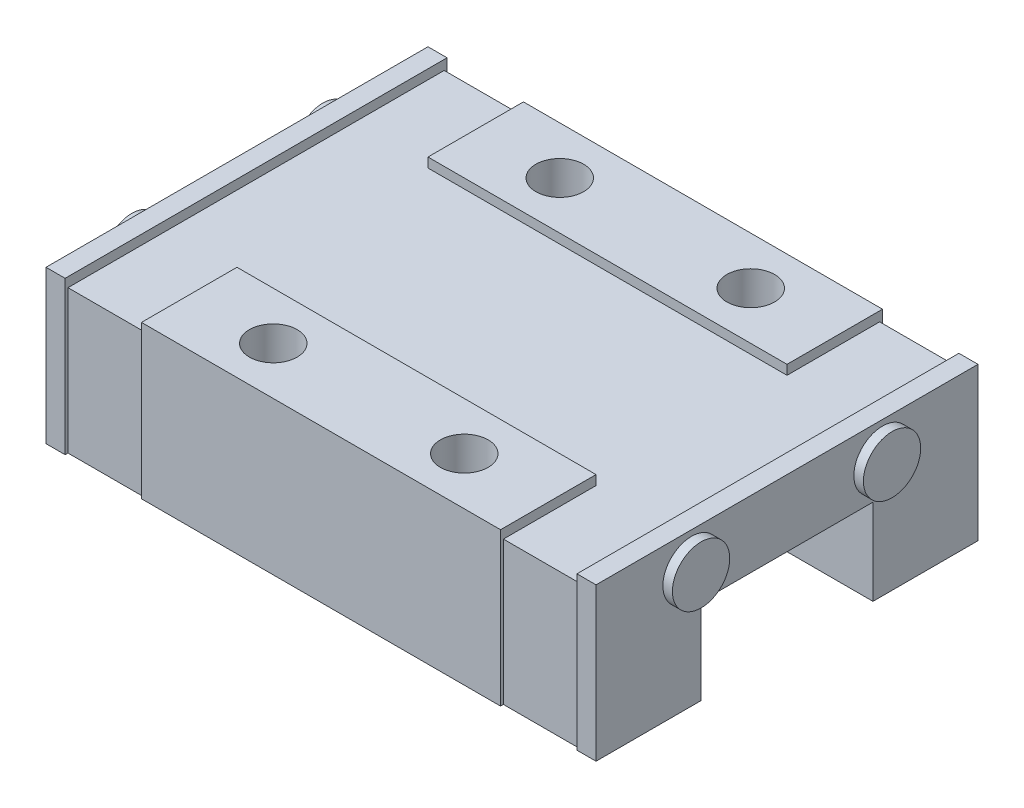
ISO-10303-21;
HEADER;
FILE_DESCRIPTION(('STEP AP214'),'2;1');
FILE_NAME('part.step','',(''),(''),'','','');
FILE_SCHEMA(('AUTOMOTIVE_DESIGN { 1 0 10303 214 1 1 1 1 }'));
ENDSEC;
DATA;
#1=APPLICATION_CONTEXT('core data for automotive mechanical design processes');
#2=APPLICATION_PROTOCOL_DEFINITION('international standard','automotive_design',2000,#1);
#3=PRODUCT_CONTEXT('',#1,'mechanical');
#4=PRODUCT('Part','Part','',(#3));
#5=PRODUCT_RELATED_PRODUCT_CATEGORY('part','',(#4));
#6=PRODUCT_DEFINITION_FORMATION('','',#4);
#7=PRODUCT_DEFINITION_CONTEXT('part definition',#1,'design');
#8=PRODUCT_DEFINITION('design','',#6,#7);
#9=PRODUCT_DEFINITION_SHAPE('','',#8);
#10=(LENGTH_UNIT() NAMED_UNIT(*) SI_UNIT(.MILLI.,.METRE.));
#11=(NAMED_UNIT(*) PLANE_ANGLE_UNIT() SI_UNIT($,.RADIAN.));
#12=(NAMED_UNIT(*) SI_UNIT($,.STERADIAN.) SOLID_ANGLE_UNIT());
#13=UNCERTAINTY_MEASURE_WITH_UNIT(LENGTH_MEASURE(1.E-05),#10,'distance_accuracy_value','');
#14=(GEOMETRIC_REPRESENTATION_CONTEXT(3) GLOBAL_UNCERTAINTY_ASSIGNED_CONTEXT((#13)) GLOBAL_UNIT_ASSIGNED_CONTEXT((#10,
#11,#12)) REPRESENTATION_CONTEXT('',''));
#15=CARTESIAN_POINT('',(0.,0.,0.));
#16=DIRECTION('',(0.,0.,1.));
#17=DIRECTION('',(1.,0.,0.));
#18=AXIS2_PLACEMENT_3D('',#15,#16,#17);
#19=CARTESIAN_POINT('',(0.,8.,0.));
#20=DIRECTION('',(1.,0.,0.));
#21=DIRECTION('',(0.,0.,-1.));
#22=AXIS2_PLACEMENT_3D('',#19,#20,#21);
#23=PLANE('',#22);
#24=DIRECTION('',(0.,0.,1.));
#25=VECTOR('',#24,1.);
#26=CARTESIAN_POINT('',(0.,0.,0.));
#27=LINE('',#26,#25);
#28=CARTESIAN_POINT('',(0.,0.,-20.));
#29=VERTEX_POINT('',#28);
#30=CARTESIAN_POINT('',(0.,0.,-19.85));
#31=VERTEX_POINT('',#30);
#32=EDGE_CURVE('E487',#29,#31,#27,.T.);
#33=ORIENTED_EDGE('',*,*,#32,.T.);
#34=DIRECTION('',(0.,1.,0.));
#35=VECTOR('',#34,1.);
#36=CARTESIAN_POINT('',(0.,0.,-19.85));
#37=LINE('',#36,#35);
#38=CARTESIAN_POINT('',(0.,7.5,-19.85));
#39=VERTEX_POINT('',#38);
#40=EDGE_CURVE('E329',#31,#39,#37,.T.);
#41=ORIENTED_EDGE('',*,*,#40,.T.);
#42=DIRECTION('',(0.,0.,1.));
#43=VECTOR('',#42,1.);
#44=CARTESIAN_POINT('',(0.,7.5,-14.5));
#45=LINE('',#44,#43);
#46=CARTESIAN_POINT('',(0.,7.5,-15.));
#47=VERTEX_POINT('',#46);
#48=EDGE_CURVE('E333',#39,#47,#45,.T.);
#49=ORIENTED_EDGE('',*,*,#48,.T.);
#50=DIRECTION('',(0.,1.,0.));
#51=VECTOR('',#50,1.);
#52=CARTESIAN_POINT('',(0.,7.5,-15.));
#53=LINE('',#52,#51);
#54=CARTESIAN_POINT('',(0.,8.,-15.));
#55=VERTEX_POINT('',#54);
#56=EDGE_CURVE('E424',#47,#55,#53,.T.);
#57=ORIENTED_EDGE('',*,*,#56,.T.);
#58=DIRECTION('',(0.,0.,1.));
#59=VECTOR('',#58,1.);
#60=CARTESIAN_POINT('',(0.,8.,0.));
#61=LINE('',#60,#59);
#62=CARTESIAN_POINT('',(0.,8.,-20.));
#63=VERTEX_POINT('',#62);
#64=EDGE_CURVE('E470',#63,#55,#61,.T.);
#65=ORIENTED_EDGE('',*,*,#64,.F.);
#66=DIRECTION('',(0.,-1.,0.));
#67=VECTOR('',#66,1.);
#68=CARTESIAN_POINT('',(0.,8.,-20.));
#69=LINE('',#68,#67);
#70=EDGE_CURVE('E486',#63,#29,#69,.T.);
#71=ORIENTED_EDGE('',*,*,#70,.T.);
#72=EDGE_LOOP('',(#33,#41,#49,#57,#65,#71));
#73=FACE_BOUND('',#72,.T.);
#74=ADVANCED_FACE('F43',(#73),#23,.F.);
#75=CARTESIAN_POINT('',(18.8,8.,0.));
#76=DIRECTION('',(-1.,0.,0.));
#77=DIRECTION('',(0.,0.,1.));
#78=AXIS2_PLACEMENT_3D('',#75,#76,#77);
#79=PLANE('',#78);
#80=DIRECTION('',(0.,-1.,0.));
#81=VECTOR('',#80,1.);
#82=CARTESIAN_POINT('',(18.8,0.,-0.15));
#83=LINE('',#82,#81);
#84=CARTESIAN_POINT('',(18.8,7.5,-0.15));
#85=VERTEX_POINT('',#84);
#86=CARTESIAN_POINT('',(18.8,0.,-0.15));
#87=VERTEX_POINT('',#86);
#88=EDGE_CURVE('E67',#85,#87,#83,.T.);
#89=ORIENTED_EDGE('',*,*,#88,.F.);
#90=DIRECTION('',(0.,0.,1.));
#91=VECTOR('',#90,1.);
#92=CARTESIAN_POINT('',(18.8,7.5,-5.5));
#93=LINE('',#92,#91);
#94=CARTESIAN_POINT('',(18.8,7.5,-5.));
#95=VERTEX_POINT('',#94);
#96=EDGE_CURVE('E385',#95,#85,#93,.T.);
#97=ORIENTED_EDGE('',*,*,#96,.F.);
#98=DIRECTION('',(0.,1.,0.));
#99=VECTOR('',#98,1.);
#100=CARTESIAN_POINT('',(18.8,7.5,-5.));
#101=LINE('',#100,#99);
#102=CARTESIAN_POINT('',(18.8,8.,-5.));
#103=VERTEX_POINT('',#102);
#104=EDGE_CURVE('E432',#95,#103,#101,.T.);
#105=ORIENTED_EDGE('',*,*,#104,.T.);
#106=DIRECTION('',(0.,0.,-1.));
#107=VECTOR('',#106,1.);
#108=CARTESIAN_POINT('',(18.8,8.,0.));
#109=LINE('',#108,#107);
#110=CARTESIAN_POINT('',(18.8,8.,0.));
#111=VERTEX_POINT('',#110);
#112=EDGE_CURVE('E479',#111,#103,#109,.T.);
#113=ORIENTED_EDGE('',*,*,#112,.F.);
#114=DIRECTION('',(0.,-1.,0.));
#115=VECTOR('',#114,1.);
#116=CARTESIAN_POINT('',(18.8,8.,0.));
#117=LINE('',#116,#115);
#118=CARTESIAN_POINT('',(18.8,0.,0.));
#119=VERTEX_POINT('',#118);
#120=EDGE_CURVE('E508',#111,#119,#117,.T.);
#121=ORIENTED_EDGE('',*,*,#120,.T.);
#122=DIRECTION('',(0.,0.,-1.));
#123=VECTOR('',#122,1.);
#124=CARTESIAN_POINT('',(18.8,0.,0.));
#125=LINE('',#124,#123);
#126=EDGE_CURVE('E495',#119,#87,#125,.T.);
#127=ORIENTED_EDGE('',*,*,#126,.T.);
#128=EDGE_LOOP('',(#89,#97,#105,#113,#121,#127));
#129=FACE_BOUND('',#128,.T.);
#130=ADVANCED_FACE('F678',(#129),#79,.F.);
#131=CARTESIAN_POINT('',(18.8,7.5,-19.85));
#132=VERTEX_POINT('',#131);
#133=CARTESIAN_POINT('',(18.8,7.5,-15.));
#134=VERTEX_POINT('',#133);
#135=EDGE_CURVE('E381',#132,#134,#93,.T.);
#136=ORIENTED_EDGE('',*,*,#135,.F.);
#137=DIRECTION('',(0.,1.,0.));
#138=VECTOR('',#137,1.);
#139=CARTESIAN_POINT('',(18.8,0.,-19.85));
#140=LINE('',#139,#138);
#141=CARTESIAN_POINT('',(18.8,0.,-19.85));
#142=VERTEX_POINT('',#141);
#143=EDGE_CURVE('E364',#142,#132,#140,.T.);
#144=ORIENTED_EDGE('',*,*,#143,.F.);
#145=CARTESIAN_POINT('',(18.8,0.,-20.));
#146=VERTEX_POINT('',#145);
#147=EDGE_CURVE('E494',#142,#146,#125,.T.);
#148=ORIENTED_EDGE('',*,*,#147,.T.);
#149=DIRECTION('',(0.,-1.,0.));
#150=VECTOR('',#149,1.);
#151=CARTESIAN_POINT('',(18.8,8.,-20.));
#152=LINE('',#151,#150);
#153=CARTESIAN_POINT('',(18.8,8.,-20.));
#154=VERTEX_POINT('',#153);
#155=EDGE_CURVE('E504',#154,#146,#152,.T.);
#156=ORIENTED_EDGE('',*,*,#155,.F.);
#157=CARTESIAN_POINT('',(18.8,8.,-15.));
#158=VERTEX_POINT('',#157);
#159=EDGE_CURVE('E478',#158,#154,#109,.T.);
#160=ORIENTED_EDGE('',*,*,#159,.F.);
#161=DIRECTION('',(0.,1.,0.));
#162=VECTOR('',#161,1.);
#163=CARTESIAN_POINT('',(18.8,7.5,-15.));
#164=LINE('',#163,#162);
#165=EDGE_CURVE('E429',#134,#158,#164,.T.);
#166=ORIENTED_EDGE('',*,*,#165,.F.);
#167=EDGE_LOOP('',(#136,#144,#148,#156,#160,#166));
#168=FACE_BOUND('',#167,.T.);
#169=ADVANCED_FACE('F546',(#168),#79,.F.);
#170=CARTESIAN_POINT('',(0.,0.,0.));
#171=DIRECTION('',(0.,-1.,0.));
#172=DIRECTION('',(0.,0.,-1.));
#173=AXIS2_PLACEMENT_3D('',#170,#171,#172);
#174=PLANE('',#173);
#175=ORIENTED_EDGE('',*,*,#147,.F.);
#176=DIRECTION('',(-1.,0.,0.));
#177=VECTOR('',#176,1.);
#178=CARTESIAN_POINT('',(22.8,0.,-19.85));
#179=LINE('',#178,#177);
#180=CARTESIAN_POINT('',(22.8,0.,-19.85));
#181=VERTEX_POINT('',#180);
#182=EDGE_CURVE('E399',#181,#142,#179,.T.);
#183=ORIENTED_EDGE('',*,*,#182,.F.);
#184=DIRECTION('',(0.,0.,-1.));
#185=VECTOR('',#184,1.);
#186=CARTESIAN_POINT('',(22.8,0.,-20.));
#187=LINE('',#186,#185);
#188=CARTESIAN_POINT('',(22.8,0.,-20.));
#189=VERTEX_POINT('',#188);
#190=EDGE_CURVE('E304',#181,#189,#187,.T.);
#191=ORIENTED_EDGE('',*,*,#190,.T.);
#192=DIRECTION('',(-1.,0.,0.));
#193=VECTOR('',#192,1.);
#194=CARTESIAN_POINT('',(23.8,0.,-20.));
#195=LINE('',#194,#193);
#196=CARTESIAN_POINT('',(23.8,0.,-20.));
#197=VERTEX_POINT('',#196);
#198=EDGE_CURVE('E320',#197,#189,#195,.T.);
#199=ORIENTED_EDGE('',*,*,#198,.F.);
#200=DIRECTION('',(0.,0.,-1.));
#201=VECTOR('',#200,1.);
#202=CARTESIAN_POINT('',(23.8,0.,-14.5));
#203=LINE('',#202,#201);
#204=CARTESIAN_POINT('',(23.8,0.,-14.5));
#205=VERTEX_POINT('',#204);
#206=EDGE_CURVE('E291',#205,#197,#203,.T.);
#207=ORIENTED_EDGE('',*,*,#206,.F.);
#208=DIRECTION('',(-1.,0.,0.));
#209=VECTOR('',#208,1.);
#210=CARTESIAN_POINT('',(0.,0.,-14.5));
#211=LINE('',#210,#209);
#212=CARTESIAN_POINT('',(-5.,0.,-14.5));
#213=VERTEX_POINT('',#212);
#214=EDGE_CURVE('E516',#205,#213,#211,.T.);
#215=ORIENTED_EDGE('',*,*,#214,.T.);
#216=DIRECTION('',(0.,0.,-1.));
#217=VECTOR('',#216,1.);
#218=CARTESIAN_POINT('',(-5.,0.,-20.));
#219=LINE('',#218,#217);
#220=CARTESIAN_POINT('',(-5.,0.,-20.));
#221=VERTEX_POINT('',#220);
#222=EDGE_CURVE('E616',#213,#221,#219,.T.);
#223=ORIENTED_EDGE('',*,*,#222,.T.);
#224=DIRECTION('',(-1.,0.,0.));
#225=VECTOR('',#224,1.);
#226=CARTESIAN_POINT('',(-4.,0.,-20.));
#227=LINE('',#226,#225);
#228=CARTESIAN_POINT('',(-4.,0.,-20.));
#229=VERTEX_POINT('',#228);
#230=EDGE_CURVE('E258',#229,#221,#227,.T.);
#231=ORIENTED_EDGE('',*,*,#230,.F.);
#232=DIRECTION('',(0.,0.,-1.));
#233=VECTOR('',#232,1.);
#234=CARTESIAN_POINT('',(-4.,0.,-14.5));
#235=LINE('',#234,#233);
#236=CARTESIAN_POINT('',(-4.,0.,-19.85));
#237=VERTEX_POINT('',#236);
#238=EDGE_CURVE('E240',#237,#229,#235,.T.);
#239=ORIENTED_EDGE('',*,*,#238,.F.);
#240=DIRECTION('',(-1.,0.,0.));
#241=VECTOR('',#240,1.);
#242=CARTESIAN_POINT('',(0.,0.,-19.85));
#243=LINE('',#242,#241);
#244=EDGE_CURVE('E360',#31,#237,#243,.T.);
#245=ORIENTED_EDGE('',*,*,#244,.F.);
#246=ORIENTED_EDGE('',*,*,#32,.F.);
#247=DIRECTION('',(-1.,0.,0.));
#248=VECTOR('',#247,1.);
#249=CARTESIAN_POINT('',(0.,0.,-20.));
#250=LINE('',#249,#248);
#251=EDGE_CURVE('E498',#146,#29,#250,.T.);
#252=ORIENTED_EDGE('',*,*,#251,.F.);
#253=EDGE_LOOP('',(#175,#183,#191,#199,#207,#215,#223,#231,#239,#245,#246,#252));
#254=FACE_BOUND('',#253,.T.);
#255=ADVANCED_FACE('F551',(#254),#174,.T.);
#256=CARTESIAN_POINT('',(0.,8.,0.));
#257=DIRECTION('',(0.,-1.,0.));
#258=DIRECTION('',(0.,0.,-1.));
#259=AXIS2_PLACEMENT_3D('',#256,#257,#258);
#260=PLANE('',#259);
#261=CARTESIAN_POINT('',(14.4,8.,-17.5));
#262=DIRECTION('',(0.,1.,0.));
#263=DIRECTION('',(0.,0.,1.));
#264=AXIS2_PLACEMENT_3D('',#261,#262,#263);
#265=CIRCLE('',#264,1.25);
#266=CARTESIAN_POINT('',(14.4,8.,-16.25));
#267=VERTEX_POINT('',#266);
#268=EDGE_CURVE('E447',#267,#267,#265,.T.);
#269=ORIENTED_EDGE('',*,*,#268,.F.);
#270=EDGE_LOOP('',(#269));
#271=FACE_BOUND('',#270,.T.);
#272=CARTESIAN_POINT('',(4.39999999999995,8.,-17.5));
#273=DIRECTION('',(0.,1.,0.));
#274=DIRECTION('',(0.,0.,1.));
#275=AXIS2_PLACEMENT_3D('',#272,#273,#274);
#276=CIRCLE('',#275,1.25);
#277=CARTESIAN_POINT('',(4.39999999999995,8.,-16.25));
#278=VERTEX_POINT('',#277);
#279=EDGE_CURVE('E455',#278,#278,#276,.T.);
#280=ORIENTED_EDGE('',*,*,#279,.F.);
#281=EDGE_LOOP('',(#280));
#282=FACE_BOUND('',#281,.T.);
#283=ORIENTED_EDGE('',*,*,#64,.T.);
#284=DIRECTION('',(-1.,0.,0.));
#285=VECTOR('',#284,1.);
#286=CARTESIAN_POINT('',(0.,8.,-15.));
#287=LINE('',#286,#285);
#288=EDGE_CURVE('E415',#158,#55,#287,.T.);
#289=ORIENTED_EDGE('',*,*,#288,.F.);
#290=ORIENTED_EDGE('',*,*,#159,.T.);
#291=DIRECTION('',(-1.,0.,0.));
#292=VECTOR('',#291,1.);
#293=CARTESIAN_POINT('',(0.,8.,-20.));
#294=LINE('',#293,#292);
#295=EDGE_CURVE('E483',#154,#63,#294,.T.);
#296=ORIENTED_EDGE('',*,*,#295,.T.);
#297=EDGE_LOOP('',(#283,#289,#290,#296));
#298=FACE_BOUND('',#297,.T.);
#299=ADVANCED_FACE('F572',(#271,#282,#298),#260,.F.);
#300=DIRECTION('',(0.,1.,0.));
#301=VECTOR('',#300,1.);
#302=CARTESIAN_POINT('',(0.,7.5,-5.));
#303=LINE('',#302,#301);
#304=CARTESIAN_POINT('',(0.,7.5,-5.));
#305=VERTEX_POINT('',#304);
#306=CARTESIAN_POINT('',(0.,8.,-5.));
#307=VERTEX_POINT('',#306);
#308=EDGE_CURVE('E419',#305,#307,#303,.T.);
#309=ORIENTED_EDGE('',*,*,#308,.F.);
#310=CARTESIAN_POINT('',(0.,7.5,-0.15));
#311=VERTEX_POINT('',#310);
#312=EDGE_CURVE('E338',#305,#311,#45,.T.);
#313=ORIENTED_EDGE('',*,*,#312,.T.);
#314=DIRECTION('',(0.,-1.,0.));
#315=VECTOR('',#314,1.);
#316=CARTESIAN_POINT('',(0.,0.,-0.15));
#317=LINE('',#316,#315);
#318=CARTESIAN_POINT('',(0.,0.,-0.15));
#319=VERTEX_POINT('',#318);
#320=EDGE_CURVE('E337',#311,#319,#317,.T.);
#321=ORIENTED_EDGE('',*,*,#320,.T.);
#322=CARTESIAN_POINT('',(0.,0.,0.));
#323=VERTEX_POINT('',#322);
#324=EDGE_CURVE('E466',#319,#323,#27,.T.);
#325=ORIENTED_EDGE('',*,*,#324,.T.);
#326=DIRECTION('',(0.,-1.,0.));
#327=VECTOR('',#326,1.);
#328=CARTESIAN_POINT('',(0.,8.,0.));
#329=LINE('',#328,#327);
#330=CARTESIAN_POINT('',(0.,8.,0.));
#331=VERTEX_POINT('',#330);
#332=EDGE_CURVE('E512',#331,#323,#329,.T.);
#333=ORIENTED_EDGE('',*,*,#332,.F.);
#334=EDGE_CURVE('E475',#307,#331,#61,.T.);
#335=ORIENTED_EDGE('',*,*,#334,.F.);
#336=EDGE_LOOP('',(#309,#313,#321,#325,#333,#335));
#337=FACE_BOUND('',#336,.T.);
#338=ADVANCED_FACE('F45',(#337),#23,.F.);
#339=CARTESIAN_POINT('',(0.,8.,0.));
#340=DIRECTION('',(0.,0.,-1.));
#341=DIRECTION('',(-1.,0.,0.));
#342=AXIS2_PLACEMENT_3D('',#339,#340,#341);
#343=PLANE('',#342);
#344=DIRECTION('',(1.,0.,0.));
#345=VECTOR('',#344,1.);
#346=CARTESIAN_POINT('',(0.,0.,0.));
#347=LINE('',#346,#345);
#348=EDGE_CURVE('E491',#323,#119,#347,.T.);
#349=ORIENTED_EDGE('',*,*,#348,.T.);
#350=ORIENTED_EDGE('',*,*,#120,.F.);
#351=DIRECTION('',(1.,0.,0.));
#352=VECTOR('',#351,1.);
#353=CARTESIAN_POINT('',(0.,8.,0.));
#354=LINE('',#353,#352);
#355=EDGE_CURVE('E474',#331,#111,#354,.T.);
#356=ORIENTED_EDGE('',*,*,#355,.F.);
#357=ORIENTED_EDGE('',*,*,#332,.T.);
#358=EDGE_LOOP('',(#349,#350,#356,#357));
#359=FACE_BOUND('',#358,.T.);
#360=ADVANCED_FACE('F562',(#359),#343,.F.);
#361=CARTESIAN_POINT('',(0.,8.,-20.));
#362=DIRECTION('',(0.,0.,1.));
#363=DIRECTION('',(1.,0.,0.));
#364=AXIS2_PLACEMENT_3D('',#361,#362,#363);
#365=PLANE('',#364);
#366=ORIENTED_EDGE('',*,*,#251,.T.);
#367=ORIENTED_EDGE('',*,*,#70,.F.);
#368=ORIENTED_EDGE('',*,*,#295,.F.);
#369=ORIENTED_EDGE('',*,*,#155,.T.);
#370=EDGE_LOOP('',(#366,#367,#368,#369));
#371=FACE_BOUND('',#370,.T.);
#372=ADVANCED_FACE('F576',(#371),#365,.F.);
#373=CARTESIAN_POINT('',(14.4000000000001,8.,-2.5));
#374=DIRECTION('',(0.,1.,0.));
#375=DIRECTION('',(0.,0.,1.));
#376=AXIS2_PLACEMENT_3D('',#373,#374,#375);
#377=CIRCLE('',#376,1.25);
#378=CARTESIAN_POINT('',(14.4000000000001,8.,-1.25));
#379=VERTEX_POINT('',#378);
#380=EDGE_CURVE('E438',#379,#379,#377,.T.);
#381=ORIENTED_EDGE('',*,*,#380,.F.);
#382=EDGE_LOOP('',(#381));
#383=FACE_BOUND('',#382,.T.);
#384=CARTESIAN_POINT('',(4.4,8.,-2.5));
#385=DIRECTION('',(0.,1.,0.));
#386=DIRECTION('',(0.,0.,1.));
#387=AXIS2_PLACEMENT_3D('',#384,#385,#386);
#388=CIRCLE('',#387,1.25);
#389=CARTESIAN_POINT('',(4.4,8.,-1.25));
#390=VERTEX_POINT('',#389);
#391=EDGE_CURVE('E442',#390,#390,#388,.T.);
#392=ORIENTED_EDGE('',*,*,#391,.F.);
#393=EDGE_LOOP('',(#392));
#394=FACE_BOUND('',#393,.T.);
#395=ORIENTED_EDGE('',*,*,#112,.T.);
#396=DIRECTION('',(1.,0.,0.));
#397=VECTOR('',#396,1.);
#398=CARTESIAN_POINT('',(0.,8.,-5.));
#399=LINE('',#398,#397);
#400=EDGE_CURVE('E407',#307,#103,#399,.T.);
#401=ORIENTED_EDGE('',*,*,#400,.F.);
#402=ORIENTED_EDGE('',*,*,#334,.T.);
#403=ORIENTED_EDGE('',*,*,#355,.T.);
#404=EDGE_LOOP('',(#395,#401,#402,#403));
#405=FACE_BOUND('',#404,.T.);
#406=ADVANCED_FACE('F565',(#383,#394,#405),#260,.F.);
#407=DIRECTION('',(-1.,0.,0.));
#408=VECTOR('',#407,1.);
#409=CARTESIAN_POINT('',(0.,0.,-5.5));
#410=LINE('',#409,#408);
#411=CARTESIAN_POINT('',(23.8,0.,-5.5));
#412=VERTEX_POINT('',#411);
#413=CARTESIAN_POINT('',(-5.,0.,-5.5));
#414=VERTEX_POINT('',#413);
#415=EDGE_CURVE('E519',#412,#414,#410,.T.);
#416=ORIENTED_EDGE('',*,*,#415,.F.);
#417=DIRECTION('',(0.,0.,-1.));
#418=VECTOR('',#417,1.);
#419=CARTESIAN_POINT('',(23.8,0.,0.));
#420=LINE('',#419,#418);
#421=CARTESIAN_POINT('',(23.8,0.,0.));
#422=VERTEX_POINT('',#421);
#423=EDGE_CURVE('E274',#422,#412,#420,.T.);
#424=ORIENTED_EDGE('',*,*,#423,.F.);
#425=DIRECTION('',(-1.,0.,0.));
#426=VECTOR('',#425,1.);
#427=CARTESIAN_POINT('',(23.8,0.,0.));
#428=LINE('',#427,#426);
#429=CARTESIAN_POINT('',(22.8,0.,0.));
#430=VERTEX_POINT('',#429);
#431=EDGE_CURVE('E324',#422,#430,#428,.T.);
#432=ORIENTED_EDGE('',*,*,#431,.T.);
#433=DIRECTION('',(0.,0.,-1.));
#434=VECTOR('',#433,1.);
#435=CARTESIAN_POINT('',(22.8,0.,-5.5));
#436=LINE('',#435,#434);
#437=CARTESIAN_POINT('',(22.8,0.,-0.15));
#438=VERTEX_POINT('',#437);
#439=EDGE_CURVE('E263',#430,#438,#436,.T.);
#440=ORIENTED_EDGE('',*,*,#439,.T.);
#441=DIRECTION('',(-1.,0.,0.));
#442=VECTOR('',#441,1.);
#443=CARTESIAN_POINT('',(22.8,0.,-0.15));
#444=LINE('',#443,#442);
#445=EDGE_CURVE('E377',#438,#87,#444,.T.);
#446=ORIENTED_EDGE('',*,*,#445,.T.);
#447=ORIENTED_EDGE('',*,*,#126,.F.);
#448=ORIENTED_EDGE('',*,*,#348,.F.);
#449=ORIENTED_EDGE('',*,*,#324,.F.);
#450=DIRECTION('',(-1.,0.,0.));
#451=VECTOR('',#450,1.);
#452=CARTESIAN_POINT('',(0.,0.,-0.15));
#453=LINE('',#452,#451);
#454=CARTESIAN_POINT('',(-4.,0.,-0.15));
#455=VERTEX_POINT('',#454);
#456=EDGE_CURVE('E59',#319,#455,#453,.T.);
#457=ORIENTED_EDGE('',*,*,#456,.T.);
#458=DIRECTION('',(0.,0.,-1.));
#459=VECTOR('',#458,1.);
#460=CARTESIAN_POINT('',(-4.,0.,0.));
#461=LINE('',#460,#459);
#462=CARTESIAN_POINT('',(-4.,0.,0.));
#463=VERTEX_POINT('',#462);
#464=EDGE_CURVE('E230',#463,#455,#461,.T.);
#465=ORIENTED_EDGE('',*,*,#464,.F.);
#466=DIRECTION('',(-1.,0.,0.));
#467=VECTOR('',#466,1.);
#468=CARTESIAN_POINT('',(-4.,0.,0.));
#469=LINE('',#468,#467);
#470=CARTESIAN_POINT('',(-5.,0.,0.));
#471=VERTEX_POINT('',#470);
#472=EDGE_CURVE('E235',#463,#471,#469,.T.);
#473=ORIENTED_EDGE('',*,*,#472,.T.);
#474=DIRECTION('',(0.,0.,-1.));
#475=VECTOR('',#474,1.);
#476=CARTESIAN_POINT('',(-5.,0.,-5.5));
#477=LINE('',#476,#475);
#478=EDGE_CURVE('E600',#471,#414,#477,.T.);
#479=ORIENTED_EDGE('',*,*,#478,.T.);
#480=EDGE_LOOP('',(#416,#424,#432,#440,#446,#447,#448,#449,#457,#465,#473,#479));
#481=FACE_BOUND('',#480,.T.);
#482=ADVANCED_FACE('F232',(#481),#174,.T.);
#483=CARTESIAN_POINT('',(4.4,1.,-2.5));
#484=DIRECTION('',(0.,1.,0.));
#485=DIRECTION('',(0.,0.,1.));
#486=AXIS2_PLACEMENT_3D('',#483,#484,#485);
#487=CYLINDRICAL_SURFACE('',#486,1.25);
#488=CARTESIAN_POINT('',(4.4,1.,-2.5));
#489=DIRECTION('',(0.,1.,0.));
#490=DIRECTION('',(0.,0.,1.));
#491=AXIS2_PLACEMENT_3D('',#488,#489,#490);
#492=CIRCLE('',#491,1.25);
#493=CARTESIAN_POINT('',(4.4,1.,-1.25));
#494=VERTEX_POINT('',#493);
#495=EDGE_CURVE('E462',#494,#494,#492,.T.);
#496=ORIENTED_EDGE('',*,*,#495,.F.);
#497=EDGE_LOOP('',(#496));
#498=FACE_BOUND('',#497,.T.);
#499=ORIENTED_EDGE('',*,*,#391,.T.);
#500=EDGE_LOOP('',(#499));
#501=FACE_BOUND('',#500,.T.);
#502=ADVANCED_FACE('F705',(#498,#501),#487,.F.);
#503=CARTESIAN_POINT('',(4.4,1.,-2.5));
#504=DIRECTION('',(0.,1.,0.));
#505=DIRECTION('',(0.,0.,1.));
#506=AXIS2_PLACEMENT_3D('',#503,#504,#505);
#507=PLANE('',#506);
#508=ORIENTED_EDGE('',*,*,#495,.T.);
#509=EDGE_LOOP('',(#508));
#510=FACE_BOUND('',#509,.T.);
#511=ADVANCED_FACE('F713',(#510),#507,.T.);
#512=CARTESIAN_POINT('',(14.4000000000001,1.,-2.5));
#513=DIRECTION('',(0.,1.,0.));
#514=DIRECTION('',(0.,0.,1.));
#515=AXIS2_PLACEMENT_3D('',#512,#513,#514);
#516=CYLINDRICAL_SURFACE('',#515,1.25);
#517=CARTESIAN_POINT('',(14.4000000000001,1.,-2.5));
#518=DIRECTION('',(0.,1.,0.));
#519=DIRECTION('',(0.,0.,1.));
#520=AXIS2_PLACEMENT_3D('',#517,#518,#519);
#521=CIRCLE('',#520,1.25);
#522=CARTESIAN_POINT('',(14.4000000000001,1.,-1.25));
#523=VERTEX_POINT('',#522);
#524=EDGE_CURVE('E443',#523,#523,#521,.T.);
#525=ORIENTED_EDGE('',*,*,#524,.F.);
#526=EDGE_LOOP('',(#525));
#527=FACE_BOUND('',#526,.T.);
#528=ORIENTED_EDGE('',*,*,#380,.T.);
#529=EDGE_LOOP('',(#528));
#530=FACE_BOUND('',#529,.T.);
#531=ADVANCED_FACE('F718',(#527,#530),#516,.F.);
#532=CARTESIAN_POINT('',(14.4000000000001,1.,-2.5));
#533=DIRECTION('',(0.,1.,0.));
#534=DIRECTION('',(0.,0.,1.));
#535=AXIS2_PLACEMENT_3D('',#532,#533,#534);
#536=PLANE('',#535);
#537=ORIENTED_EDGE('',*,*,#524,.T.);
#538=EDGE_LOOP('',(#537));
#539=FACE_BOUND('',#538,.T.);
#540=ADVANCED_FACE('F737',(#539),#536,.T.);
#541=CARTESIAN_POINT('',(14.4,1.,-17.5));
#542=DIRECTION('',(0.,1.,0.));
#543=DIRECTION('',(0.,0.,1.));
#544=AXIS2_PLACEMENT_3D('',#541,#542,#543);
#545=CYLINDRICAL_SURFACE('',#544,1.25);
#546=CARTESIAN_POINT('',(14.4,1.,-17.5));
#547=DIRECTION('',(0.,1.,0.));
#548=DIRECTION('',(0.,0.,1.));
#549=AXIS2_PLACEMENT_3D('',#546,#547,#548);
#550=CIRCLE('',#549,1.25);
#551=CARTESIAN_POINT('',(14.4,1.,-16.25));
#552=VERTEX_POINT('',#551);
#553=EDGE_CURVE('E451',#552,#552,#550,.T.);
#554=ORIENTED_EDGE('',*,*,#553,.F.);
#555=EDGE_LOOP('',(#554));
#556=FACE_BOUND('',#555,.T.);
#557=ORIENTED_EDGE('',*,*,#268,.T.);
#558=EDGE_LOOP('',(#557));
#559=FACE_BOUND('',#558,.T.);
#560=ADVANCED_FACE('F733',(#556,#559),#545,.F.);
#561=CARTESIAN_POINT('',(14.4,1.,-17.5));
#562=DIRECTION('',(0.,1.,0.));
#563=DIRECTION('',(0.,0.,1.));
#564=AXIS2_PLACEMENT_3D('',#561,#562,#563);
#565=PLANE('',#564);
#566=ORIENTED_EDGE('',*,*,#553,.T.);
#567=EDGE_LOOP('',(#566));
#568=FACE_BOUND('',#567,.T.);
#569=ADVANCED_FACE('F729',(#568),#565,.T.);
#570=CARTESIAN_POINT('',(4.39999999999995,1.,-17.5));
#571=DIRECTION('',(0.,1.,0.));
#572=DIRECTION('',(0.,0.,1.));
#573=AXIS2_PLACEMENT_3D('',#570,#571,#572);
#574=CYLINDRICAL_SURFACE('',#573,1.25);
#575=CARTESIAN_POINT('',(4.39999999999995,1.,-17.5));
#576=DIRECTION('',(0.,1.,0.));
#577=DIRECTION('',(0.,0.,1.));
#578=AXIS2_PLACEMENT_3D('',#575,#576,#577);
#579=CIRCLE('',#578,1.25);
#580=CARTESIAN_POINT('',(4.39999999999995,1.,-16.25));
#581=VERTEX_POINT('',#580);
#582=EDGE_CURVE('E428',#581,#581,#579,.T.);
#583=ORIENTED_EDGE('',*,*,#582,.F.);
#584=EDGE_LOOP('',(#583));
#585=FACE_BOUND('',#584,.T.);
#586=ORIENTED_EDGE('',*,*,#279,.T.);
#587=EDGE_LOOP('',(#586));
#588=FACE_BOUND('',#587,.T.);
#589=ADVANCED_FACE('F725',(#585,#588),#574,.F.);
#590=CARTESIAN_POINT('',(4.39999999999995,1.,-17.5));
#591=DIRECTION('',(0.,1.,0.));
#592=DIRECTION('',(0.,0.,1.));
#593=AXIS2_PLACEMENT_3D('',#590,#591,#592);
#594=PLANE('',#593);
#595=ORIENTED_EDGE('',*,*,#582,.T.);
#596=EDGE_LOOP('',(#595));
#597=FACE_BOUND('',#596,.T.);
#598=ADVANCED_FACE('F723',(#597),#594,.T.);
#599=CARTESIAN_POINT('',(0.,7.5,-15.));
#600=DIRECTION('',(0.,0.,-1.));
#601=DIRECTION('',(-1.,0.,0.));
#602=AXIS2_PLACEMENT_3D('',#599,#600,#601);
#603=PLANE('',#602);
#604=ORIENTED_EDGE('',*,*,#288,.T.);
#605=ORIENTED_EDGE('',*,*,#56,.F.);
#606=DIRECTION('',(-1.,0.,0.));
#607=VECTOR('',#606,1.);
#608=CARTESIAN_POINT('',(0.,7.5,-15.));
#609=LINE('',#608,#607);
#610=EDGE_CURVE('E414',#134,#47,#609,.T.);
#611=ORIENTED_EDGE('',*,*,#610,.F.);
#612=ORIENTED_EDGE('',*,*,#165,.T.);
#613=EDGE_LOOP('',(#604,#605,#611,#612));
#614=FACE_BOUND('',#613,.T.);
#615=ADVANCED_FACE('F582',(#614),#603,.F.);
#616=CARTESIAN_POINT('',(0.,7.5,-5.));
#617=DIRECTION('',(0.,0.,1.));
#618=DIRECTION('',(1.,0.,0.));
#619=AXIS2_PLACEMENT_3D('',#616,#617,#618);
#620=PLANE('',#619);
#621=ORIENTED_EDGE('',*,*,#400,.T.);
#622=ORIENTED_EDGE('',*,*,#104,.F.);
#623=DIRECTION('',(1.,0.,0.));
#624=VECTOR('',#623,1.);
#625=CARTESIAN_POINT('',(0.,7.5,-5.));
#626=LINE('',#625,#624);
#627=EDGE_CURVE('E410',#305,#95,#626,.T.);
#628=ORIENTED_EDGE('',*,*,#627,.F.);
#629=ORIENTED_EDGE('',*,*,#308,.T.);
#630=EDGE_LOOP('',(#621,#622,#628,#629));
#631=FACE_BOUND('',#630,.T.);
#632=ADVANCED_FACE('F745',(#631),#620,.F.);
#633=CARTESIAN_POINT('',(0.,7.5,0.));
#634=DIRECTION('',(0.,1.,0.));
#635=DIRECTION('',(0.,0.,1.));
#636=AXIS2_PLACEMENT_3D('',#633,#634,#635);
#637=PLANE('',#636);
#638=ORIENTED_EDGE('',*,*,#610,.T.);
#639=ORIENTED_EDGE('',*,*,#48,.F.);
#640=DIRECTION('',(-1.,0.,0.));
#641=VECTOR('',#640,1.);
#642=CARTESIAN_POINT('',(0.,7.5,-19.85));
#643=LINE('',#642,#641);
#644=CARTESIAN_POINT('',(-4.,7.5,-19.85));
#645=VERTEX_POINT('',#644);
#646=EDGE_CURVE('E356',#39,#645,#643,.T.);
#647=ORIENTED_EDGE('',*,*,#646,.T.);
#648=DIRECTION('',(0.,0.,1.));
#649=VECTOR('',#648,1.);
#650=CARTESIAN_POINT('',(-4.,7.5,-5.5));
#651=LINE('',#650,#649);
#652=CARTESIAN_POINT('',(-4.,7.5,-0.15));
#653=VERTEX_POINT('',#652);
#654=EDGE_CURVE('E344',#645,#653,#651,.T.);
#655=ORIENTED_EDGE('',*,*,#654,.T.);
#656=DIRECTION('',(-1.,0.,0.));
#657=VECTOR('',#656,1.);
#658=CARTESIAN_POINT('',(0.,7.5,-0.15));
#659=LINE('',#658,#657);
#660=EDGE_CURVE('E352',#311,#653,#659,.T.);
#661=ORIENTED_EDGE('',*,*,#660,.F.);
#662=ORIENTED_EDGE('',*,*,#312,.F.);
#663=ORIENTED_EDGE('',*,*,#627,.T.);
#664=ORIENTED_EDGE('',*,*,#96,.T.);
#665=DIRECTION('',(-1.,0.,0.));
#666=VECTOR('',#665,1.);
#667=CARTESIAN_POINT('',(22.8,7.5,-0.15));
#668=LINE('',#667,#666);
#669=CARTESIAN_POINT('',(22.8,7.5,-0.15));
#670=VERTEX_POINT('',#669);
#671=EDGE_CURVE('E391',#670,#85,#668,.T.);
#672=ORIENTED_EDGE('',*,*,#671,.F.);
#673=DIRECTION('',(0.,0.,1.));
#674=VECTOR('',#673,1.);
#675=CARTESIAN_POINT('',(22.8,7.5,-14.5));
#676=LINE('',#675,#674);
#677=CARTESIAN_POINT('',(22.8,7.5,-19.85));
#678=VERTEX_POINT('',#677);
#679=EDGE_CURVE('E369',#678,#670,#676,.T.);
#680=ORIENTED_EDGE('',*,*,#679,.F.);
#681=DIRECTION('',(-1.,0.,0.));
#682=VECTOR('',#681,1.);
#683=CARTESIAN_POINT('',(22.8,7.5,-19.85));
#684=LINE('',#683,#682);
#685=EDGE_CURVE('E395',#678,#132,#684,.T.);
#686=ORIENTED_EDGE('',*,*,#685,.T.);
#687=ORIENTED_EDGE('',*,*,#135,.T.);
#688=EDGE_LOOP('',(#638,#639,#647,#655,#661,#662,#663,#664,#672,#680,#686,#687));
#689=FACE_BOUND('',#688,.T.);
#690=ADVANCED_FACE('F531',(#689),#637,.T.);
#691=CARTESIAN_POINT('',(-1.2,4.5,-5.5));
#692=DIRECTION('',(0.,-1.,0.));
#693=DIRECTION('',(0.,0.,-1.));
#694=AXIS2_PLACEMENT_3D('',#691,#692,#693);
#695=PLANE('',#694);
#696=DIRECTION('',(1.,0.,0.));
#697=VECTOR('',#696,1.);
#698=CARTESIAN_POINT('',(-1.2,4.5,-5.5));
#699=LINE('',#698,#697);
#700=CARTESIAN_POINT('',(-5.,4.5,-5.5));
#701=VERTEX_POINT('',#700);
#702=CARTESIAN_POINT('',(23.8,4.5,-5.5));
#703=VERTEX_POINT('',#702);
#704=EDGE_CURVE('E404',#701,#703,#699,.T.);
#705=ORIENTED_EDGE('',*,*,#704,.F.);
#706=DIRECTION('',(0.,0.,-1.));
#707=VECTOR('',#706,1.);
#708=CARTESIAN_POINT('',(-5.,4.5,-5.5));
#709=LINE('',#708,#707);
#710=CARTESIAN_POINT('',(-5.,4.5,-14.5));
#711=VERTEX_POINT('',#710);
#712=EDGE_CURVE('E608',#701,#711,#709,.T.);
#713=ORIENTED_EDGE('',*,*,#712,.T.);
#714=DIRECTION('',(1.,0.,0.));
#715=VECTOR('',#714,1.);
#716=CARTESIAN_POINT('',(-1.2,4.5,-14.5));
#717=LINE('',#716,#715);
#718=CARTESIAN_POINT('',(23.8,4.5,-14.5));
#719=VERTEX_POINT('',#718);
#720=EDGE_CURVE('E403',#711,#719,#717,.T.);
#721=ORIENTED_EDGE('',*,*,#720,.T.);
#722=DIRECTION('',(0.,0.,-1.));
#723=VECTOR('',#722,1.);
#724=CARTESIAN_POINT('',(23.8,4.5,-5.5));
#725=LINE('',#724,#723);
#726=EDGE_CURVE('E283',#703,#719,#725,.T.);
#727=ORIENTED_EDGE('',*,*,#726,.F.);
#728=EDGE_LOOP('',(#705,#713,#721,#727));
#729=FACE_BOUND('',#728,.T.);
#730=ADVANCED_FACE('F649',(#729),#695,.T.);
#731=CARTESIAN_POINT('',(-1.2,4.5,-5.5));
#732=DIRECTION('',(0.,0.,1.));
#733=DIRECTION('',(0.,-1.,0.));
#734=AXIS2_PLACEMENT_3D('',#731,#732,#733);
#735=PLANE('',#734);
#736=ORIENTED_EDGE('',*,*,#704,.T.);
#737=DIRECTION('',(0.,1.,0.));
#738=VECTOR('',#737,1.);
#739=CARTESIAN_POINT('',(23.8,0.,-5.5));
#740=LINE('',#739,#738);
#741=EDGE_CURVE('E279',#412,#703,#740,.T.);
#742=ORIENTED_EDGE('',*,*,#741,.F.);
#743=ORIENTED_EDGE('',*,*,#415,.T.);
#744=DIRECTION('',(0.,1.,0.));
#745=VECTOR('',#744,1.);
#746=CARTESIAN_POINT('',(-5.,0.,-5.5));
#747=LINE('',#746,#745);
#748=EDGE_CURVE('E604',#414,#701,#747,.T.);
#749=ORIENTED_EDGE('',*,*,#748,.T.);
#750=EDGE_LOOP('',(#736,#742,#743,#749));
#751=FACE_BOUND('',#750,.T.);
#752=ADVANCED_FACE('F647',(#751),#735,.F.);
#753=CARTESIAN_POINT('',(-1.2,4.5,-14.5));
#754=DIRECTION('',(0.,0.,1.));
#755=DIRECTION('',(0.,-1.,0.));
#756=AXIS2_PLACEMENT_3D('',#753,#754,#755);
#757=PLANE('',#756);
#758=ORIENTED_EDGE('',*,*,#720,.F.);
#759=DIRECTION('',(0.,-1.,0.));
#760=VECTOR('',#759,1.);
#761=CARTESIAN_POINT('',(-5.,0.,-14.5));
#762=LINE('',#761,#760);
#763=EDGE_CURVE('E612',#711,#213,#762,.T.);
#764=ORIENTED_EDGE('',*,*,#763,.T.);
#765=ORIENTED_EDGE('',*,*,#214,.F.);
#766=DIRECTION('',(0.,-1.,0.));
#767=VECTOR('',#766,1.);
#768=CARTESIAN_POINT('',(23.8,0.,-14.5));
#769=LINE('',#768,#767);
#770=EDGE_CURVE('E287',#719,#205,#769,.T.);
#771=ORIENTED_EDGE('',*,*,#770,.F.);
#772=EDGE_LOOP('',(#758,#764,#765,#771));
#773=FACE_BOUND('',#772,.T.);
#774=ADVANCED_FACE('F653',(#773),#757,.T.);
#775=CARTESIAN_POINT('',(22.8,0.,-19.85));
#776=DIRECTION('',(0.,0.,1.));
#777=DIRECTION('',(1.,0.,0.));
#778=AXIS2_PLACEMENT_3D('',#775,#776,#777);
#779=PLANE('',#778);
#780=ORIENTED_EDGE('',*,*,#143,.T.);
#781=ORIENTED_EDGE('',*,*,#685,.F.);
#782=DIRECTION('',(0.,1.,0.));
#783=VECTOR('',#782,1.);
#784=CARTESIAN_POINT('',(22.8,0.,-19.85));
#785=LINE('',#784,#783);
#786=EDGE_CURVE('E365',#181,#678,#785,.T.);
#787=ORIENTED_EDGE('',*,*,#786,.F.);
#788=ORIENTED_EDGE('',*,*,#182,.T.);
#789=EDGE_LOOP('',(#780,#781,#787,#788));
#790=FACE_BOUND('',#789,.T.);
#791=ADVANCED_FACE('F543',(#790),#779,.F.);
#792=CARTESIAN_POINT('',(22.8,0.,-0.15));
#793=DIRECTION('',(0.,0.,-1.));
#794=DIRECTION('',(-1.,0.,0.));
#795=AXIS2_PLACEMENT_3D('',#792,#793,#794);
#796=PLANE('',#795);
#797=ORIENTED_EDGE('',*,*,#88,.T.);
#798=ORIENTED_EDGE('',*,*,#445,.F.);
#799=DIRECTION('',(0.,-1.,0.));
#800=VECTOR('',#799,1.);
#801=CARTESIAN_POINT('',(22.8,0.,-0.15));
#802=LINE('',#801,#800);
#803=EDGE_CURVE('E373',#670,#438,#802,.T.);
#804=ORIENTED_EDGE('',*,*,#803,.F.);
#805=ORIENTED_EDGE('',*,*,#671,.T.);
#806=EDGE_LOOP('',(#797,#798,#804,#805));
#807=FACE_BOUND('',#806,.T.);
#808=ADVANCED_FACE('F537',(#807),#796,.F.);
#809=CARTESIAN_POINT('',(0.,0.,-19.85));
#810=DIRECTION('',(0.,0.,1.));
#811=DIRECTION('',(1.,0.,0.));
#812=AXIS2_PLACEMENT_3D('',#809,#810,#811);
#813=PLANE('',#812);
#814=DIRECTION('',(0.,1.,0.));
#815=VECTOR('',#814,1.);
#816=CARTESIAN_POINT('',(-4.,0.,-19.85));
#817=LINE('',#816,#815);
#818=EDGE_CURVE('E328',#237,#645,#817,.T.);
#819=ORIENTED_EDGE('',*,*,#818,.T.);
#820=ORIENTED_EDGE('',*,*,#646,.F.);
#821=ORIENTED_EDGE('',*,*,#40,.F.);
#822=ORIENTED_EDGE('',*,*,#244,.T.);
#823=EDGE_LOOP('',(#819,#820,#821,#822));
#824=FACE_BOUND('',#823,.T.);
#825=ADVANCED_FACE('F585',(#824),#813,.F.);
#826=CARTESIAN_POINT('',(0.,0.,-0.15));
#827=DIRECTION('',(0.,0.,-1.));
#828=DIRECTION('',(-1.,0.,0.));
#829=AXIS2_PLACEMENT_3D('',#826,#827,#828);
#830=PLANE('',#829);
#831=DIRECTION('',(0.,-1.,0.));
#832=VECTOR('',#831,1.);
#833=CARTESIAN_POINT('',(-4.,0.,-0.15));
#834=LINE('',#833,#832);
#835=EDGE_CURVE('E334',#653,#455,#834,.T.);
#836=ORIENTED_EDGE('',*,*,#835,.T.);
#837=ORIENTED_EDGE('',*,*,#456,.F.);
#838=ORIENTED_EDGE('',*,*,#320,.F.);
#839=ORIENTED_EDGE('',*,*,#660,.T.);
#840=EDGE_LOOP('',(#836,#837,#838,#839));
#841=FACE_BOUND('',#840,.T.);
#842=ADVANCED_FACE('F668',(#841),#830,.F.);
#843=CARTESIAN_POINT('',(23.8,0.,0.));
#844=DIRECTION('',(0.,0.,-1.));
#845=DIRECTION('',(-1.,0.,0.));
#846=AXIS2_PLACEMENT_3D('',#843,#844,#845);
#847=PLANE('',#846);
#848=DIRECTION('',(0.,-1.,0.));
#849=VECTOR('',#848,1.);
#850=CARTESIAN_POINT('',(22.8,0.,0.));
#851=LINE('',#850,#849);
#852=CARTESIAN_POINT('',(22.8,8.,0.));
#853=VERTEX_POINT('',#852);
#854=EDGE_CURVE('E257',#853,#430,#851,.T.);
#855=ORIENTED_EDGE('',*,*,#854,.T.);
#856=ORIENTED_EDGE('',*,*,#431,.F.);
#857=DIRECTION('',(0.,-1.,0.));
#858=VECTOR('',#857,1.);
#859=CARTESIAN_POINT('',(23.8,0.,0.));
#860=LINE('',#859,#858);
#861=CARTESIAN_POINT('',(23.8,8.,0.));
#862=VERTEX_POINT('',#861);
#863=EDGE_CURVE('E270',#862,#422,#860,.T.);
#864=ORIENTED_EDGE('',*,*,#863,.F.);
#865=DIRECTION('',(-1.,0.,0.));
#866=VECTOR('',#865,1.);
#867=CARTESIAN_POINT('',(23.8,8.,0.));
#868=LINE('',#867,#866);
#869=EDGE_CURVE('E299',#862,#853,#868,.T.);
#870=ORIENTED_EDGE('',*,*,#869,.T.);
#871=EDGE_LOOP('',(#855,#856,#864,#870));
#872=FACE_BOUND('',#871,.T.);
#873=ADVANCED_FACE('F666',(#872),#847,.F.);
#874=CARTESIAN_POINT('',(23.8,0.,-20.));
#875=DIRECTION('',(0.,0.,1.));
#876=DIRECTION('',(1.,0.,0.));
#877=AXIS2_PLACEMENT_3D('',#874,#875,#876);
#878=PLANE('',#877);
#879=DIRECTION('',(0.,1.,0.));
#880=VECTOR('',#879,1.);
#881=CARTESIAN_POINT('',(22.8,0.,-20.));
#882=LINE('',#881,#880);
#883=CARTESIAN_POINT('',(22.8,8.,-20.));
#884=VERTEX_POINT('',#883);
#885=EDGE_CURVE('E307',#189,#884,#882,.T.);
#886=ORIENTED_EDGE('',*,*,#885,.T.);
#887=DIRECTION('',(-1.,0.,0.));
#888=VECTOR('',#887,1.);
#889=CARTESIAN_POINT('',(23.8,8.,-20.));
#890=LINE('',#889,#888);
#891=CARTESIAN_POINT('',(23.8,8.,-20.));
#892=VERTEX_POINT('',#891);
#893=EDGE_CURVE('E316',#892,#884,#890,.T.);
#894=ORIENTED_EDGE('',*,*,#893,.F.);
#895=DIRECTION('',(0.,1.,0.));
#896=VECTOR('',#895,1.);
#897=CARTESIAN_POINT('',(23.8,0.,-20.));
#898=LINE('',#897,#896);
#899=EDGE_CURVE('E294',#197,#892,#898,.T.);
#900=ORIENTED_EDGE('',*,*,#899,.F.);
#901=ORIENTED_EDGE('',*,*,#198,.T.);
#902=EDGE_LOOP('',(#886,#894,#900,#901));
#903=FACE_BOUND('',#902,.T.);
#904=ADVANCED_FACE('F660',(#903),#878,.F.);
#905=CARTESIAN_POINT('',(23.8,8.,0.));
#906=DIRECTION('',(0.,-1.,0.));
#907=DIRECTION('',(0.,0.,-1.));
#908=AXIS2_PLACEMENT_3D('',#905,#906,#907);
#909=PLANE('',#908);
#910=DIRECTION('',(0.,0.,1.));
#911=VECTOR('',#910,1.);
#912=CARTESIAN_POINT('',(22.8,8.,0.));
#913=LINE('',#912,#911);
#914=EDGE_CURVE('E275',#884,#853,#913,.T.);
#915=ORIENTED_EDGE('',*,*,#914,.T.);
#916=ORIENTED_EDGE('',*,*,#869,.F.);
#917=DIRECTION('',(0.,0.,1.));
#918=VECTOR('',#917,1.);
#919=CARTESIAN_POINT('',(23.8,8.,-20.));
#920=LINE('',#919,#918);
#921=EDGE_CURVE('E297',#892,#862,#920,.T.);
#922=ORIENTED_EDGE('',*,*,#921,.F.);
#923=ORIENTED_EDGE('',*,*,#893,.T.);
#924=EDGE_LOOP('',(#915,#916,#922,#923));
#925=FACE_BOUND('',#924,.T.);
#926=ADVANCED_FACE('F663',(#925),#909,.F.);
#927=CARTESIAN_POINT('',(23.8,0.,0.));
#928=DIRECTION('',(-1.,0.,0.));
#929=DIRECTION('',(0.,0.,1.));
#930=AXIS2_PLACEMENT_3D('',#927,#928,#929);
#931=PLANE('',#930);
#932=CARTESIAN_POINT('',(23.8,6.2,-15.));
#933=DIRECTION('',(-1.,0.,0.));
#934=DIRECTION('',(0.,0.,1.));
#935=AXIS2_PLACEMENT_3D('',#932,#933,#934);
#936=CIRCLE('',#935,1.5);
#937=CARTESIAN_POINT('',(23.8,6.2,-13.5));
#938=VERTEX_POINT('',#937);
#939=EDGE_CURVE('E11',#938,#938,#936,.F.);
#940=ORIENTED_EDGE('',*,*,#939,.F.);
#941=EDGE_LOOP('',(#940));
#942=FACE_BOUND('',#941,.T.);
#943=CARTESIAN_POINT('',(23.8,6.2,-5.));
#944=DIRECTION('',(-1.,0.,0.));
#945=DIRECTION('',(0.,0.,1.));
#946=AXIS2_PLACEMENT_3D('',#943,#944,#945);
#947=CIRCLE('',#946,1.5);
#948=CARTESIAN_POINT('',(23.8,6.2,-3.5));
#949=VERTEX_POINT('',#948);
#950=EDGE_CURVE('E52',#949,#949,#947,.F.);
#951=ORIENTED_EDGE('',*,*,#950,.F.);
#952=EDGE_LOOP('',(#951));
#953=FACE_BOUND('',#952,.T.);
#954=ORIENTED_EDGE('',*,*,#863,.T.);
#955=ORIENTED_EDGE('',*,*,#423,.T.);
#956=ORIENTED_EDGE('',*,*,#741,.T.);
#957=ORIENTED_EDGE('',*,*,#726,.T.);
#958=ORIENTED_EDGE('',*,*,#770,.T.);
#959=ORIENTED_EDGE('',*,*,#206,.T.);
#960=ORIENTED_EDGE('',*,*,#899,.T.);
#961=ORIENTED_EDGE('',*,*,#921,.T.);
#962=EDGE_LOOP('',(#954,#955,#956,#957,#958,#959,#960,#961));
#963=FACE_BOUND('',#962,.T.);
#964=ADVANCED_FACE('F643',(#942,#953,#963),#931,.F.);
#965=CARTESIAN_POINT('',(22.8,0.,0.));
#966=DIRECTION('',(-1.,0.,0.));
#967=DIRECTION('',(0.,0.,1.));
#968=AXIS2_PLACEMENT_3D('',#965,#966,#967);
#969=PLANE('',#968);
#970=ORIENTED_EDGE('',*,*,#190,.F.);
#971=ORIENTED_EDGE('',*,*,#786,.T.);
#972=ORIENTED_EDGE('',*,*,#679,.T.);
#973=ORIENTED_EDGE('',*,*,#803,.T.);
#974=ORIENTED_EDGE('',*,*,#439,.F.);
#975=ORIENTED_EDGE('',*,*,#854,.F.);
#976=ORIENTED_EDGE('',*,*,#914,.F.);
#977=ORIENTED_EDGE('',*,*,#885,.F.);
#978=EDGE_LOOP('',(#970,#971,#972,#973,#974,#975,#976,#977));
#979=FACE_BOUND('',#978,.T.);
#980=ADVANCED_FACE('F540',(#979),#969,.T.);
#981=CARTESIAN_POINT('',(-4.,0.,0.));
#982=DIRECTION('',(0.,0.,-1.));
#983=DIRECTION('',(-1.,0.,0.));
#984=AXIS2_PLACEMENT_3D('',#981,#982,#983);
#985=PLANE('',#984);
#986=DIRECTION('',(0.,-1.,0.));
#987=VECTOR('',#986,1.);
#988=CARTESIAN_POINT('',(-5.,0.,0.));
#989=LINE('',#988,#987);
#990=CARTESIAN_POINT('',(-5.,8.,0.));
#991=VERTEX_POINT('',#990);
#992=EDGE_CURVE('E255',#991,#471,#989,.T.);
#993=ORIENTED_EDGE('',*,*,#992,.T.);
#994=ORIENTED_EDGE('',*,*,#472,.F.);
#995=DIRECTION('',(0.,-1.,0.));
#996=VECTOR('',#995,1.);
#997=CARTESIAN_POINT('',(-4.,0.,0.));
#998=LINE('',#997,#996);
#999=CARTESIAN_POINT('',(-4.,8.,0.));
#1000=VERTEX_POINT('',#999);
#1001=EDGE_CURVE('E241',#1000,#463,#998,.T.);
#1002=ORIENTED_EDGE('',*,*,#1001,.F.);
#1003=DIRECTION('',(-1.,0.,0.));
#1004=VECTOR('',#1003,1.);
#1005=CARTESIAN_POINT('',(-4.,8.,0.));
#1006=LINE('',#1005,#1004);
#1007=EDGE_CURVE('E597',#1000,#991,#1006,.T.);
#1008=ORIENTED_EDGE('',*,*,#1007,.T.);
#1009=EDGE_LOOP('',(#993,#994,#1002,#1008));
#1010=FACE_BOUND('',#1009,.T.);
#1011=ADVANCED_FACE('F253',(#1010),#985,.F.);
#1012=CARTESIAN_POINT('',(-4.,0.,-20.));
#1013=DIRECTION('',(0.,0.,1.));
#1014=DIRECTION('',(1.,0.,0.));
#1015=AXIS2_PLACEMENT_3D('',#1012,#1013,#1014);
#1016=PLANE('',#1015);
#1017=DIRECTION('',(0.,1.,0.));
#1018=VECTOR('',#1017,1.);
#1019=CARTESIAN_POINT('',(-5.,0.,-20.));
#1020=LINE('',#1019,#1018);
#1021=CARTESIAN_POINT('',(-5.,8.,-20.));
#1022=VERTEX_POINT('',#1021);
#1023=EDGE_CURVE('E619',#221,#1022,#1020,.T.);
#1024=ORIENTED_EDGE('',*,*,#1023,.T.);
#1025=DIRECTION('',(-1.,0.,0.));
#1026=VECTOR('',#1025,1.);
#1027=CARTESIAN_POINT('',(-4.,8.,-20.));
#1028=LINE('',#1027,#1026);
#1029=CARTESIAN_POINT('',(-4.,8.,-20.));
#1030=VERTEX_POINT('',#1029);
#1031=EDGE_CURVE('E266',#1030,#1022,#1028,.T.);
#1032=ORIENTED_EDGE('',*,*,#1031,.F.);
#1033=DIRECTION('',(0.,1.,0.));
#1034=VECTOR('',#1033,1.);
#1035=CARTESIAN_POINT('',(-4.,0.,-20.));
#1036=LINE('',#1035,#1034);
#1037=EDGE_CURVE('E590',#229,#1030,#1036,.T.);
#1038=ORIENTED_EDGE('',*,*,#1037,.F.);
#1039=ORIENTED_EDGE('',*,*,#230,.T.);
#1040=EDGE_LOOP('',(#1024,#1032,#1038,#1039));
#1041=FACE_BOUND('',#1040,.T.);
#1042=ADVANCED_FACE('F632',(#1041),#1016,.F.);
#1043=CARTESIAN_POINT('',(-4.,8.,0.));
#1044=DIRECTION('',(0.,-1.,0.));
#1045=DIRECTION('',(0.,0.,-1.));
#1046=AXIS2_PLACEMENT_3D('',#1043,#1044,#1045);
#1047=PLANE('',#1046);
#1048=DIRECTION('',(0.,0.,1.));
#1049=VECTOR('',#1048,1.);
#1050=CARTESIAN_POINT('',(-5.,8.,0.));
#1051=LINE('',#1050,#1049);
#1052=EDGE_CURVE('E251',#1022,#991,#1051,.T.);
#1053=ORIENTED_EDGE('',*,*,#1052,.T.);
#1054=ORIENTED_EDGE('',*,*,#1007,.F.);
#1055=DIRECTION('',(0.,0.,1.));
#1056=VECTOR('',#1055,1.);
#1057=CARTESIAN_POINT('',(-4.,8.,-20.));
#1058=LINE('',#1057,#1056);
#1059=EDGE_CURVE('E246',#1030,#1000,#1058,.T.);
#1060=ORIENTED_EDGE('',*,*,#1059,.F.);
#1061=ORIENTED_EDGE('',*,*,#1031,.T.);
#1062=EDGE_LOOP('',(#1053,#1054,#1060,#1061));
#1063=FACE_BOUND('',#1062,.T.);
#1064=ADVANCED_FACE('F630',(#1063),#1047,.F.);
#1065=CARTESIAN_POINT('',(-4.,0.,0.));
#1066=DIRECTION('',(-1.,0.,0.));
#1067=DIRECTION('',(0.,0.,1.));
#1068=AXIS2_PLACEMENT_3D('',#1065,#1066,#1067);
#1069=PLANE('',#1068);
#1070=ORIENTED_EDGE('',*,*,#835,.F.);
#1071=ORIENTED_EDGE('',*,*,#654,.F.);
#1072=ORIENTED_EDGE('',*,*,#818,.F.);
#1073=ORIENTED_EDGE('',*,*,#238,.T.);
#1074=ORIENTED_EDGE('',*,*,#1037,.T.);
#1075=ORIENTED_EDGE('',*,*,#1059,.T.);
#1076=ORIENTED_EDGE('',*,*,#1001,.T.);
#1077=ORIENTED_EDGE('',*,*,#464,.T.);
#1078=EDGE_LOOP('',(#1070,#1071,#1072,#1073,#1074,#1075,#1076,#1077));
#1079=FACE_BOUND('',#1078,.T.);
#1080=ADVANCED_FACE('F244',(#1079),#1069,.F.);
#1081=CARTESIAN_POINT('',(-5.,0.,0.));
#1082=DIRECTION('',(-1.,0.,0.));
#1083=DIRECTION('',(0.,0.,1.));
#1084=AXIS2_PLACEMENT_3D('',#1081,#1082,#1083);
#1085=PLANE('',#1084);
#1086=CARTESIAN_POINT('',(-5.,6.2,-15.));
#1087=DIRECTION('',(1.,0.,0.));
#1088=DIRECTION('',(0.,0.,-1.));
#1089=AXIS2_PLACEMENT_3D('',#1086,#1087,#1088);
#1090=CIRCLE('',#1089,1.5);
#1091=CARTESIAN_POINT('',(-5.,6.2,-16.5));
#1092=VERTEX_POINT('',#1091);
#1093=EDGE_CURVE('E1183',#1092,#1092,#1090,.T.);
#1094=ORIENTED_EDGE('',*,*,#1093,.T.);
#1095=EDGE_LOOP('',(#1094));
#1096=FACE_BOUND('',#1095,.T.);
#1097=CARTESIAN_POINT('',(-5.,6.2,-5.));
#1098=DIRECTION('',(1.,0.,0.));
#1099=DIRECTION('',(0.,0.,-1.));
#1100=AXIS2_PLACEMENT_3D('',#1097,#1098,#1099);
#1101=CIRCLE('',#1100,1.5);
#1102=CARTESIAN_POINT('',(-5.,6.2,-6.5));
#1103=VERTEX_POINT('',#1102);
#1104=EDGE_CURVE('E1190',#1103,#1103,#1101,.T.);
#1105=ORIENTED_EDGE('',*,*,#1104,.T.);
#1106=EDGE_LOOP('',(#1105));
#1107=FACE_BOUND('',#1106,.T.);
#1108=ORIENTED_EDGE('',*,*,#992,.F.);
#1109=ORIENTED_EDGE('',*,*,#1052,.F.);
#1110=ORIENTED_EDGE('',*,*,#1023,.F.);
#1111=ORIENTED_EDGE('',*,*,#222,.F.);
#1112=ORIENTED_EDGE('',*,*,#763,.F.);
#1113=ORIENTED_EDGE('',*,*,#712,.F.);
#1114=ORIENTED_EDGE('',*,*,#748,.F.);
#1115=ORIENTED_EDGE('',*,*,#478,.F.);
#1116=EDGE_LOOP('',(#1108,#1109,#1110,#1111,#1112,#1113,#1114,#1115));
#1117=FACE_BOUND('',#1116,.T.);
#1118=ADVANCED_FACE('F636',(#1096,#1107,#1117),#1085,.T.);
#1119=CARTESIAN_POINT('',(24.3,6.2,-5.));
#1120=DIRECTION('',(-1.,0.,0.));
#1121=DIRECTION('',(0.,0.,1.));
#1122=AXIS2_PLACEMENT_3D('',#1119,#1120,#1121);
#1123=CYLINDRICAL_SURFACE('',#1122,1.5);
#1124=CARTESIAN_POINT('',(24.3,6.2,-5.));
#1125=DIRECTION('',(1.,0.,0.));
#1126=DIRECTION('',(0.,0.,-1.));
#1127=AXIS2_PLACEMENT_3D('',#1124,#1125,#1126);
#1128=CIRCLE('',#1127,1.5);
#1129=CARTESIAN_POINT('',(24.3,6.2,-6.5));
#1130=VERTEX_POINT('',#1129);
#1131=EDGE_CURVE('E601',#1130,#1130,#1128,.T.);
#1132=ORIENTED_EDGE('',*,*,#1131,.F.);
#1133=EDGE_LOOP('',(#1132));
#1134=FACE_BOUND('',#1133,.T.);
#1135=ORIENTED_EDGE('',*,*,#950,.T.);
#1136=EDGE_LOOP('',(#1135));
#1137=FACE_BOUND('',#1136,.T.);
#1138=ADVANCED_FACE('F817',(#1134,#1137),#1123,.T.);
#1139=CARTESIAN_POINT('',(24.3,6.2,-5.));
#1140=DIRECTION('',(1.,0.,0.));
#1141=DIRECTION('',(0.,0.,-1.));
#1142=AXIS2_PLACEMENT_3D('',#1139,#1140,#1141);
#1143=PLANE('',#1142);
#1144=ORIENTED_EDGE('',*,*,#1131,.T.);
#1145=EDGE_LOOP('',(#1144));
#1146=FACE_BOUND('',#1145,.T.);
#1147=ADVANCED_FACE('F821',(#1146),#1143,.T.);
#1148=CARTESIAN_POINT('',(24.3,6.2,-15.));
#1149=DIRECTION('',(-1.,0.,0.));
#1150=DIRECTION('',(0.,0.,1.));
#1151=AXIS2_PLACEMENT_3D('',#1148,#1149,#1150);
#1152=CYLINDRICAL_SURFACE('',#1151,1.5);
#1153=CARTESIAN_POINT('',(24.3,6.2,-15.));
#1154=DIRECTION('',(1.,0.,0.));
#1155=DIRECTION('',(0.,0.,-1.));
#1156=AXIS2_PLACEMENT_3D('',#1153,#1154,#1155);
#1157=CIRCLE('',#1156,1.5);
#1158=CARTESIAN_POINT('',(24.3,6.2,-16.5));
#1159=VERTEX_POINT('',#1158);
#1160=EDGE_CURVE('E1194',#1159,#1159,#1157,.T.);
#1161=ORIENTED_EDGE('',*,*,#1160,.F.);
#1162=EDGE_LOOP('',(#1161));
#1163=FACE_BOUND('',#1162,.T.);
#1164=ORIENTED_EDGE('',*,*,#939,.T.);
#1165=EDGE_LOOP('',(#1164));
#1166=FACE_BOUND('',#1165,.T.);
#1167=ADVANCED_FACE('F830',(#1163,#1166),#1152,.T.);
#1168=CARTESIAN_POINT('',(24.3,6.2,-15.));
#1169=DIRECTION('',(1.,0.,0.));
#1170=DIRECTION('',(0.,0.,-1.));
#1171=AXIS2_PLACEMENT_3D('',#1168,#1169,#1170);
#1172=PLANE('',#1171);
#1173=ORIENTED_EDGE('',*,*,#1160,.T.);
#1174=EDGE_LOOP('',(#1173));
#1175=FACE_BOUND('',#1174,.T.);
#1176=ADVANCED_FACE('F839',(#1175),#1172,.T.);
#1177=CARTESIAN_POINT('',(-5.,6.2,-5.));
#1178=DIRECTION('',(-1.,0.,0.));
#1179=DIRECTION('',(0.,0.,1.));
#1180=AXIS2_PLACEMENT_3D('',#1177,#1178,#1179);
#1181=CYLINDRICAL_SURFACE('',#1180,1.5);
#1182=ORIENTED_EDGE('',*,*,#1104,.F.);
#1183=EDGE_LOOP('',(#1182));
#1184=FACE_BOUND('',#1183,.T.);
#1185=CARTESIAN_POINT('',(-5.5,6.2,-5.));
#1186=DIRECTION('',(1.,0.,0.));
#1187=DIRECTION('',(0.,0.,-1.));
#1188=AXIS2_PLACEMENT_3D('',#1185,#1186,#1187);
#1189=CIRCLE('',#1188,1.5);
#1190=CARTESIAN_POINT('',(-5.5,6.2,-6.5));
#1191=VERTEX_POINT('',#1190);
#1192=EDGE_CURVE('E1187',#1191,#1191,#1189,.T.);
#1193=ORIENTED_EDGE('',*,*,#1192,.T.);
#1194=EDGE_LOOP('',(#1193));
#1195=FACE_BOUND('',#1194,.T.);
#1196=ADVANCED_FACE('F848',(#1184,#1195),#1181,.T.);
#1197=CARTESIAN_POINT('',(-5.5,6.2,-5.));
#1198=DIRECTION('',(1.,0.,0.));
#1199=DIRECTION('',(0.,0.,-1.));
#1200=AXIS2_PLACEMENT_3D('',#1197,#1198,#1199);
#1201=PLANE('',#1200);
#1202=ORIENTED_EDGE('',*,*,#1192,.F.);
#1203=EDGE_LOOP('',(#1202));
#1204=FACE_BOUND('',#1203,.T.);
#1205=ADVANCED_FACE('F864',(#1204),#1201,.F.);
#1206=CARTESIAN_POINT('',(-5.,6.2,-15.));
#1207=DIRECTION('',(-1.,0.,0.));
#1208=DIRECTION('',(0.,0.,1.));
#1209=AXIS2_PLACEMENT_3D('',#1206,#1207,#1208);
#1210=CYLINDRICAL_SURFACE('',#1209,1.5);
#1211=ORIENTED_EDGE('',*,*,#1093,.F.);
#1212=EDGE_LOOP('',(#1211));
#1213=FACE_BOUND('',#1212,.T.);
#1214=CARTESIAN_POINT('',(-5.5,6.2,-15.));
#1215=DIRECTION('',(1.,0.,0.));
#1216=DIRECTION('',(0.,0.,-1.));
#1217=AXIS2_PLACEMENT_3D('',#1214,#1215,#1216);
#1218=CIRCLE('',#1217,1.5);
#1219=CARTESIAN_POINT('',(-5.5,6.2,-16.5));
#1220=VERTEX_POINT('',#1219);
#1221=EDGE_CURVE('E1180',#1220,#1220,#1218,.T.);
#1222=ORIENTED_EDGE('',*,*,#1221,.T.);
#1223=EDGE_LOOP('',(#1222));
#1224=FACE_BOUND('',#1223,.T.);
#1225=ADVANCED_FACE('F873',(#1213,#1224),#1210,.T.);
#1226=CARTESIAN_POINT('',(-5.5,6.2,-15.));
#1227=DIRECTION('',(1.,0.,0.));
#1228=DIRECTION('',(0.,0.,-1.));
#1229=AXIS2_PLACEMENT_3D('',#1226,#1227,#1228);
#1230=PLANE('',#1229);
#1231=ORIENTED_EDGE('',*,*,#1221,.F.);
#1232=EDGE_LOOP('',(#1231));
#1233=FACE_BOUND('',#1232,.T.);
#1234=ADVANCED_FACE('F882',(#1233),#1230,.F.);
#1235=CLOSED_SHELL('',(#74,#130,#169,#255,#299,#338,#360,#372,#406,#482,#502,#511,#531,#540,
#560,#569,#589,#598,#615,#632,#690,#730,#752,#774,#791,#808,#825,#842,#873,#904,#926,#964,#980,
#1011,#1042,#1064,#1080,#1118,#1138,#1147,#1167,#1176,#1196,#1205,#1225,#1234));
#1236=MANIFOLD_SOLID_BREP('B2',#1235);
#1237=ADVANCED_BREP_SHAPE_REPRESENTATION('',(#18,#1236),#14);
#1238=SHAPE_DEFINITION_REPRESENTATION(#9,#1237);
ENDSEC;
END-ISO-10303-21;
